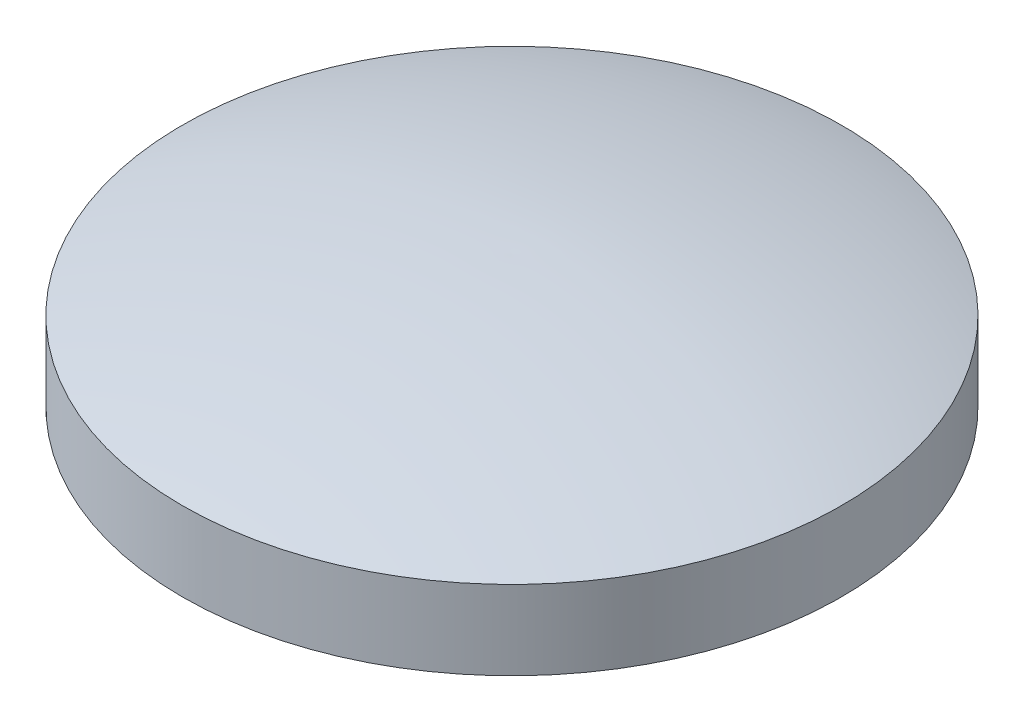
ISO-10303-21;
HEADER;
FILE_DESCRIPTION(('STEP AP214'),'2;1');
FILE_NAME('part.step','',(''),(''),'','','');
FILE_SCHEMA(('AUTOMOTIVE_DESIGN { 1 0 10303 214 1 1 1 1 }'));
ENDSEC;
DATA;
#1=APPLICATION_CONTEXT('core data for automotive mechanical design processes');
#2=APPLICATION_PROTOCOL_DEFINITION('international standard','automotive_design',2000,#1);
#3=PRODUCT_CONTEXT('',#1,'mechanical');
#4=PRODUCT('Part','Part','',(#3));
#5=PRODUCT_RELATED_PRODUCT_CATEGORY('part','',(#4));
#6=PRODUCT_DEFINITION_FORMATION('','',#4);
#7=PRODUCT_DEFINITION_CONTEXT('part definition',#1,'design');
#8=PRODUCT_DEFINITION('design','',#6,#7);
#9=PRODUCT_DEFINITION_SHAPE('','',#8);
#10=(LENGTH_UNIT() NAMED_UNIT(*) SI_UNIT(.MILLI.,.METRE.));
#11=(NAMED_UNIT(*) PLANE_ANGLE_UNIT() SI_UNIT($,.RADIAN.));
#12=(NAMED_UNIT(*) SI_UNIT($,.STERADIAN.) SOLID_ANGLE_UNIT());
#13=UNCERTAINTY_MEASURE_WITH_UNIT(LENGTH_MEASURE(1.E-05),#10,'distance_accuracy_value','');
#14=(GEOMETRIC_REPRESENTATION_CONTEXT(3) GLOBAL_UNCERTAINTY_ASSIGNED_CONTEXT((#13)) GLOBAL_UNIT_ASSIGNED_CONTEXT((#10,
#11,#12)) REPRESENTATION_CONTEXT('',''));
#15=CARTESIAN_POINT('',(0.,0.,0.));
#16=DIRECTION('',(0.,0.,1.));
#17=DIRECTION('',(1.,0.,0.));
#18=AXIS2_PLACEMENT_3D('',#15,#16,#17);
#19=CARTESIAN_POINT('',(0.,3.,0.));
#20=DIRECTION('',(0.,-1.,0.));
#21=DIRECTION('',(0.,0.,-1.));
#22=AXIS2_PLACEMENT_3D('',#19,#20,#21);
#23=CYLINDRICAL_SURFACE('',#22,12.5);
#24=CARTESIAN_POINT('',(0.,3.,0.));
#25=DIRECTION('',(0.,1.,0.));
#26=DIRECTION('',(0.,0.,1.));
#27=AXIS2_PLACEMENT_3D('',#24,#25,#26);
#28=CIRCLE('',#27,12.5);
#29=CARTESIAN_POINT('',(0.,3.,12.5));
#30=VERTEX_POINT('',#29);
#31=EDGE_CURVE('E11',#30,#30,#28,.T.);
#32=ORIENTED_EDGE('',*,*,#31,.F.);
#33=EDGE_LOOP('',(#32));
#34=FACE_BOUND('',#33,.T.);
#35=CARTESIAN_POINT('',(0.,0.,0.));
#36=DIRECTION('',(0.,1.,0.));
#37=DIRECTION('',(0.,0.,1.));
#38=AXIS2_PLACEMENT_3D('',#35,#36,#37);
#39=CIRCLE('',#38,12.5);
#40=CARTESIAN_POINT('',(0.,0.,12.5));
#41=VERTEX_POINT('',#40);
#42=EDGE_CURVE('E42',#41,#41,#39,.T.);
#43=ORIENTED_EDGE('',*,*,#42,.T.);
#44=EDGE_LOOP('',(#43));
#45=FACE_BOUND('',#44,.T.);
#46=ADVANCED_FACE('F39',(#34,#45),#23,.T.);
#47=CARTESIAN_POINT('',(0.,0.,0.));
#48=DIRECTION('',(0.,1.,0.));
#49=DIRECTION('',(0.,0.,1.));
#50=AXIS2_PLACEMENT_3D('',#47,#48,#49);
#51=PLANE('',#50);
#52=ORIENTED_EDGE('',*,*,#42,.F.);
#53=EDGE_LOOP('',(#52));
#54=FACE_BOUND('',#53,.T.);
#55=ADVANCED_FACE('F51',(#54),#51,.F.);
#56=CARTESIAN_POINT('',(0.,5.0271545638311,0.));
#57=CARTESIAN_POINT('',(0.,5.08286357485441,4.30914566522659));
#58=CARTESIAN_POINT('',(0.,4.12026978172632,9.26583771142163));
#59=CARTESIAN_POINT('',(0.,3.,12.5));
#60=B_SPLINE_CURVE_WITH_KNOTS('',3,(#56,#57,#58,#59),.UNSPECIFIED.,.F.,.F.,(4,4),(0.,
0.51183696247401),.UNSPECIFIED.);
#61=CARTESIAN_POINT('',(0.,3.,0.));
#62=DIRECTION('',(0.,-1.,0.));
#63=AXIS1_PLACEMENT('',#61,#62);
#64=SURFACE_OF_REVOLUTION('',#60,#63);
#65=ORIENTED_EDGE('',*,*,#31,.T.);
#66=EDGE_LOOP('',(#65));
#67=FACE_BOUND('',#66,.T.);
#68=CARTESIAN_POINT('',(0.,5.0271545638311,0.));
#69=VERTEX_POINT('',#68);
#70=VERTEX_LOOP('',#69);
#71=FACE_BOUND('',#70,.T.);
#72=ADVANCED_FACE('F49',(#67,#71),#64,.T.);
#73=CLOSED_SHELL('',(#46,#55,#72));
#74=MANIFOLD_SOLID_BREP('B2',#73);
#75=ADVANCED_BREP_SHAPE_REPRESENTATION('',(#18,#74),#14);
#76=SHAPE_DEFINITION_REPRESENTATION(#9,#75);
ENDSEC;
END-ISO-10303-21;
